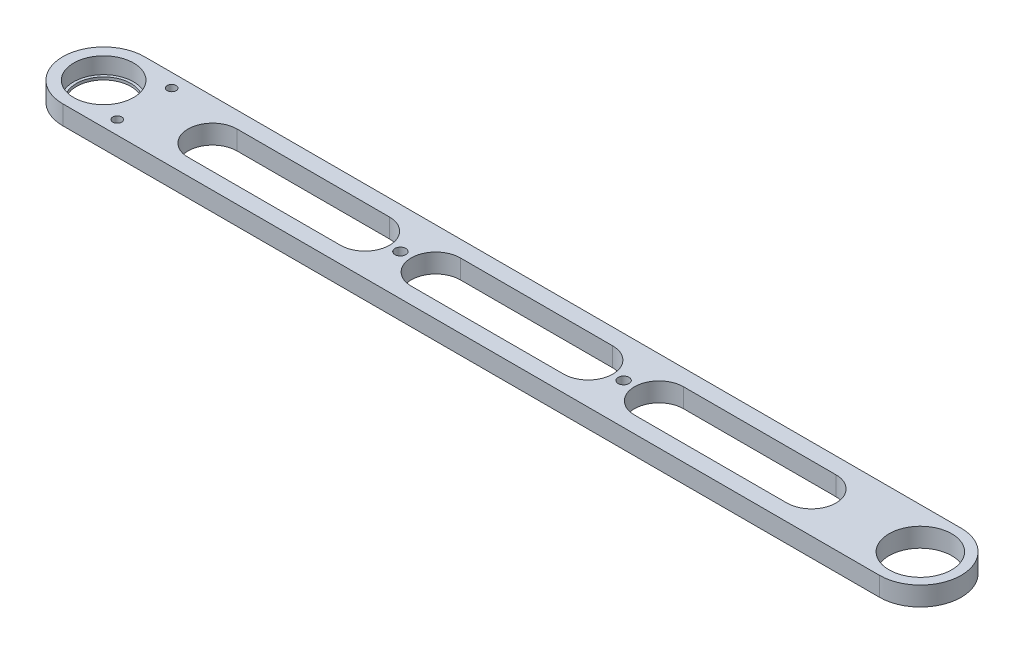
ISO-10303-21;
HEADER;
FILE_DESCRIPTION(('STEP AP214'),'2;1');
FILE_NAME('part.step','',(''),(''),'','','');
FILE_SCHEMA(('AUTOMOTIVE_DESIGN { 1 0 10303 214 1 1 1 1 }'));
ENDSEC;
DATA;
#1=APPLICATION_CONTEXT('core data for automotive mechanical design processes');
#2=APPLICATION_PROTOCOL_DEFINITION('international standard','automotive_design',2000,#1);
#3=PRODUCT_CONTEXT('',#1,'mechanical');
#4=PRODUCT('Part','Part','',(#3));
#5=PRODUCT_RELATED_PRODUCT_CATEGORY('part','',(#4));
#6=PRODUCT_DEFINITION_FORMATION('','',#4);
#7=PRODUCT_DEFINITION_CONTEXT('part definition',#1,'design');
#8=PRODUCT_DEFINITION('design','',#6,#7);
#9=PRODUCT_DEFINITION_SHAPE('','',#8);
#10=(LENGTH_UNIT() NAMED_UNIT(*) SI_UNIT(.MILLI.,.METRE.));
#11=(NAMED_UNIT(*) PLANE_ANGLE_UNIT() SI_UNIT($,.RADIAN.));
#12=(NAMED_UNIT(*) SI_UNIT($,.STERADIAN.) SOLID_ANGLE_UNIT());
#13=UNCERTAINTY_MEASURE_WITH_UNIT(LENGTH_MEASURE(1.E-05),#10,'distance_accuracy_value','');
#14=(GEOMETRIC_REPRESENTATION_CONTEXT(3) GLOBAL_UNCERTAINTY_ASSIGNED_CONTEXT((#13)) GLOBAL_UNIT_ASSIGNED_CONTEXT((#10,
#11,#12)) REPRESENTATION_CONTEXT('',''));
#15=CARTESIAN_POINT('',(0.,0.,0.));
#16=DIRECTION('',(0.,0.,1.));
#17=DIRECTION('',(1.,0.,0.));
#18=AXIS2_PLACEMENT_3D('',#15,#16,#17);
#19=CARTESIAN_POINT('',(-150.,7.,0.));
#20=DIRECTION('',(0.,-1.,0.));
#21=DIRECTION('',(0.,0.,-1.));
#22=AXIS2_PLACEMENT_3D('',#19,#20,#21);
#23=CYLINDRICAL_SURFACE('',#22,10.);
#24=CARTESIAN_POINT('',(-150.,0.,0.));
#25=DIRECTION('',(0.,1.,0.));
#26=DIRECTION('',(0.,0.,1.));
#27=AXIS2_PLACEMENT_3D('',#24,#25,#26);
#28=CIRCLE('',#27,10.);
#29=CARTESIAN_POINT('',(-150.,0.,10.));
#30=VERTEX_POINT('',#29);
#31=EDGE_CURVE('E289',#30,#30,#28,.T.);
#32=ORIENTED_EDGE('',*,*,#31,.F.);
#33=EDGE_LOOP('',(#32));
#34=FACE_BOUND('',#33,.T.);
#35=CARTESIAN_POINT('',(-150.,1.,0.));
#36=DIRECTION('',(0.,1.,0.));
#37=DIRECTION('',(0.,0.,1.));
#38=AXIS2_PLACEMENT_3D('',#35,#36,#37);
#39=CIRCLE('',#38,10.);
#40=CARTESIAN_POINT('',(-150.,1.,10.));
#41=VERTEX_POINT('',#40);
#42=EDGE_CURVE('E47',#41,#41,#39,.T.);
#43=ORIENTED_EDGE('',*,*,#42,.T.);
#44=EDGE_LOOP('',(#43));
#45=FACE_BOUND('',#44,.T.);
#46=ADVANCED_FACE('F43',(#34,#45),#23,.F.);
#47=CARTESIAN_POINT('',(150.,7.,0.));
#48=DIRECTION('',(0.,1.,0.));
#49=DIRECTION('',(0.,0.,1.));
#50=AXIS2_PLACEMENT_3D('',#47,#48,#49);
#51=PLANE('',#50);
#52=CARTESIAN_POINT('',(-135.,7.,-10.));
#53=DIRECTION('',(0.,1.,0.));
#54=DIRECTION('',(0.,0.,1.));
#55=AXIS2_PLACEMENT_3D('',#52,#53,#54);
#56=CIRCLE('',#55,1.64999999999998);
#57=CARTESIAN_POINT('',(-135.,7.,-8.35000000000005));
#58=VERTEX_POINT('',#57);
#59=EDGE_CURVE('E174',#58,#58,#56,.T.);
#60=ORIENTED_EDGE('',*,*,#59,.F.);
#61=EDGE_LOOP('',(#60));
#62=FACE_BOUND('',#61,.T.);
#63=CARTESIAN_POINT('',(-135.,7.,10.));
#64=DIRECTION('',(0.,1.,0.));
#65=DIRECTION('',(0.,0.,1.));
#66=AXIS2_PLACEMENT_3D('',#63,#64,#65);
#67=CIRCLE('',#66,1.64999999999998);
#68=CARTESIAN_POINT('',(-135.,7.,11.65));
#69=VERTEX_POINT('',#68);
#70=EDGE_CURVE('E173',#69,#69,#67,.T.);
#71=ORIENTED_EDGE('',*,*,#70,.F.);
#72=EDGE_LOOP('',(#71));
#73=FACE_BOUND('',#72,.T.);
#74=CARTESIAN_POINT('',(-150.,7.,0.));
#75=DIRECTION('',(0.,1.,0.));
#76=DIRECTION('',(0.,0.,1.));
#77=AXIS2_PLACEMENT_3D('',#74,#75,#76);
#78=CIRCLE('',#77,11.);
#79=CARTESIAN_POINT('',(-150.,7.,11.));
#80=VERTEX_POINT('',#79);
#81=EDGE_CURVE('E184',#80,#80,#78,.T.);
#82=ORIENTED_EDGE('',*,*,#81,.F.);
#83=EDGE_LOOP('',(#82));
#84=FACE_BOUND('',#83,.T.);
#85=CARTESIAN_POINT('',(40.9999999073436,7.,0.));
#86=DIRECTION('',(0.,1.,0.));
#87=DIRECTION('',(0.,0.,1.));
#88=AXIS2_PLACEMENT_3D('',#85,#86,#87);
#89=CIRCLE('',#88,2.);
#90=CARTESIAN_POINT('',(40.9999999073436,7.,2.));
#91=VERTEX_POINT('',#90);
#92=EDGE_CURVE('E197',#91,#91,#89,.T.);
#93=ORIENTED_EDGE('',*,*,#92,.F.);
#94=EDGE_LOOP('',(#93));
#95=FACE_BOUND('',#94,.T.);
#96=CARTESIAN_POINT('',(150.,7.,0.));
#97=DIRECTION('',(0.,1.,0.));
#98=DIRECTION('',(0.,0.,1.));
#99=AXIS2_PLACEMENT_3D('',#96,#97,#98);
#100=CIRCLE('',#99,11.5);
#101=CARTESIAN_POINT('',(150.,7.,11.5));
#102=VERTEX_POINT('',#101);
#103=EDGE_CURVE('E293',#102,#102,#100,.T.);
#104=ORIENTED_EDGE('',*,*,#103,.F.);
#105=EDGE_LOOP('',(#104));
#106=FACE_BOUND('',#105,.T.);
#107=CARTESIAN_POINT('',(150.,7.,0.));
#108=DIRECTION('',(0.,1.,0.));
#109=DIRECTION('',(0.,0.,1.));
#110=AXIS2_PLACEMENT_3D('',#107,#108,#109);
#111=CIRCLE('',#110,15.);
#112=CARTESIAN_POINT('',(150.,7.,15.));
#113=VERTEX_POINT('',#112);
#114=CARTESIAN_POINT('',(150.,7.,-15.0000000000001));
#115=VERTEX_POINT('',#114);
#116=EDGE_CURVE('E299',#113,#115,#111,.T.);
#117=ORIENTED_EDGE('',*,*,#116,.T.);
#118=DIRECTION('',(-1.,0.,0.));
#119=VECTOR('',#118,1.);
#120=CARTESIAN_POINT('',(-150.,7.,-15.));
#121=LINE('',#120,#119);
#122=CARTESIAN_POINT('',(-150.,7.,-15.));
#123=VERTEX_POINT('',#122);
#124=EDGE_CURVE('E302',#115,#123,#121,.T.);
#125=ORIENTED_EDGE('',*,*,#124,.T.);
#126=CARTESIAN_POINT('',(-150.,7.,0.));
#127=DIRECTION('',(0.,1.,0.));
#128=DIRECTION('',(0.,0.,1.));
#129=AXIS2_PLACEMENT_3D('',#126,#127,#128);
#130=CIRCLE('',#129,15.);
#131=CARTESIAN_POINT('',(-150.,7.,15.));
#132=VERTEX_POINT('',#131);
#133=EDGE_CURVE('E305',#123,#132,#130,.T.);
#134=ORIENTED_EDGE('',*,*,#133,.T.);
#135=DIRECTION('',(1.,0.,0.));
#136=VECTOR('',#135,1.);
#137=CARTESIAN_POINT('',(150.,7.,15.));
#138=LINE('',#137,#136);
#139=EDGE_CURVE('E307',#132,#113,#138,.T.);
#140=ORIENTED_EDGE('',*,*,#139,.T.);
#141=EDGE_LOOP('',(#117,#125,#134,#140));
#142=FACE_BOUND('',#141,.T.);
#143=DIRECTION('',(1.,0.,0.));
#144=VECTOR('',#143,1.);
#145=CARTESIAN_POINT('',(-110.,7.,9.));
#146=LINE('',#145,#144);
#147=CARTESIAN_POINT('',(-110.,7.,9.));
#148=VERTEX_POINT('',#147);
#149=CARTESIAN_POINT('',(-53.9999999803265,7.,9.));
#150=VERTEX_POINT('',#149);
#151=EDGE_CURVE('E261',#148,#150,#146,.T.);
#152=ORIENTED_EDGE('',*,*,#151,.F.);
#153=CARTESIAN_POINT('',(-110.,7.,0.));
#154=DIRECTION('',(0.,1.,0.));
#155=DIRECTION('',(0.,0.,-1.));
#156=AXIS2_PLACEMENT_3D('',#153,#154,#155);
#157=CIRCLE('',#156,9.);
#158=CARTESIAN_POINT('',(-110.,7.,-9.));
#159=VERTEX_POINT('',#158);
#160=EDGE_CURVE('E259',#159,#148,#157,.T.);
#161=ORIENTED_EDGE('',*,*,#160,.F.);
#162=DIRECTION('',(-1.,0.,0.));
#163=VECTOR('',#162,1.);
#164=CARTESIAN_POINT('',(-53.9999999803265,7.,-9.));
#165=LINE('',#164,#163);
#166=CARTESIAN_POINT('',(-53.9999999803265,7.,-9.));
#167=VERTEX_POINT('',#166);
#168=EDGE_CURVE('E267',#167,#159,#165,.T.);
#169=ORIENTED_EDGE('',*,*,#168,.F.);
#170=CARTESIAN_POINT('',(-53.9999999803265,7.,0.));
#171=DIRECTION('',(0.,1.,0.));
#172=DIRECTION('',(0.,0.,1.));
#173=AXIS2_PLACEMENT_3D('',#170,#171,#172);
#174=CIRCLE('',#173,9.);
#175=EDGE_CURVE('E264',#150,#167,#174,.T.);
#176=ORIENTED_EDGE('',*,*,#175,.F.);
#177=EDGE_LOOP('',(#152,#161,#169,#176));
#178=FACE_BOUND('',#177,.T.);
#179=DIRECTION('',(1.,0.,0.));
#180=VECTOR('',#179,1.);
#181=CARTESIAN_POINT('',(-28.00000011233,7.,9.));
#182=LINE('',#181,#180);
#183=CARTESIAN_POINT('',(-28.00000011233,7.,9.));
#184=VERTEX_POINT('',#183);
#185=CARTESIAN_POINT('',(27.9999999073436,7.,9.));
#186=VERTEX_POINT('',#185);
#187=EDGE_CURVE('E230',#184,#186,#182,.T.);
#188=ORIENTED_EDGE('',*,*,#187,.F.);
#189=CARTESIAN_POINT('',(-27.9999999803265,7.,0.));
#190=DIRECTION('',(0.,1.,0.));
#191=DIRECTION('',(0.,0.,-1.));
#192=AXIS2_PLACEMENT_3D('',#189,#190,#191);
#193=CIRCLE('',#192,9.);
#194=CARTESIAN_POINT('',(-28.00000011233,7.,-9.));
#195=VERTEX_POINT('',#194);
#196=EDGE_CURVE('E228',#195,#184,#193,.T.);
#197=ORIENTED_EDGE('',*,*,#196,.F.);
#198=DIRECTION('',(-1.,0.,0.));
#199=VECTOR('',#198,1.);
#200=CARTESIAN_POINT('',(27.9999999073436,7.,-9.));
#201=LINE('',#200,#199);
#202=CARTESIAN_POINT('',(27.9999999073436,7.,-9.));
#203=VERTEX_POINT('',#202);
#204=EDGE_CURVE('E236',#203,#195,#201,.T.);
#205=ORIENTED_EDGE('',*,*,#204,.F.);
#206=CARTESIAN_POINT('',(27.9999999073436,7.,0.));
#207=DIRECTION('',(0.,1.,0.));
#208=DIRECTION('',(0.,0.,1.));
#209=AXIS2_PLACEMENT_3D('',#206,#207,#208);
#210=CIRCLE('',#209,9.);
#211=EDGE_CURVE('E233',#186,#203,#210,.T.);
#212=ORIENTED_EDGE('',*,*,#211,.F.);
#213=EDGE_LOOP('',(#188,#197,#205,#212));
#214=FACE_BOUND('',#213,.T.);
#215=DIRECTION('',(1.,0.,0.));
#216=VECTOR('',#215,1.);
#217=CARTESIAN_POINT('',(53.9999999073436,7.,9.));
#218=LINE('',#217,#216);
#219=CARTESIAN_POINT('',(53.9999999073436,7.,9.));
#220=VERTEX_POINT('',#219);
#221=CARTESIAN_POINT('',(109.999999927017,7.,9.));
#222=VERTEX_POINT('',#221);
#223=EDGE_CURVE('E204',#220,#222,#218,.T.);
#224=ORIENTED_EDGE('',*,*,#223,.F.);
#225=CARTESIAN_POINT('',(53.9999999073436,7.,0.));
#226=DIRECTION('',(0.,1.,0.));
#227=DIRECTION('',(0.,0.,-1.));
#228=AXIS2_PLACEMENT_3D('',#225,#226,#227);
#229=CIRCLE('',#228,9.);
#230=CARTESIAN_POINT('',(53.9999999073436,7.,-9.));
#231=VERTEX_POINT('',#230);
#232=EDGE_CURVE('E202',#231,#220,#229,.T.);
#233=ORIENTED_EDGE('',*,*,#232,.F.);
#234=DIRECTION('',(-1.,0.,0.));
#235=VECTOR('',#234,1.);
#236=CARTESIAN_POINT('',(109.999999927017,7.,-9.));
#237=LINE('',#236,#235);
#238=CARTESIAN_POINT('',(109.999999927017,7.,-9.));
#239=VERTEX_POINT('',#238);
#240=EDGE_CURVE('E209',#239,#231,#237,.T.);
#241=ORIENTED_EDGE('',*,*,#240,.F.);
#242=CARTESIAN_POINT('',(110.,7.,0.));
#243=DIRECTION('',(0.,1.,0.));
#244=DIRECTION('',(0.,0.,1.));
#245=AXIS2_PLACEMENT_3D('',#242,#243,#244);
#246=CIRCLE('',#245,9.);
#247=EDGE_CURVE('E207',#222,#239,#246,.T.);
#248=ORIENTED_EDGE('',*,*,#247,.F.);
#249=EDGE_LOOP('',(#224,#233,#241,#248));
#250=FACE_BOUND('',#249,.T.);
#251=CARTESIAN_POINT('',(-40.9999999803265,7.,0.));
#252=DIRECTION('',(0.,1.,0.));
#253=DIRECTION('',(0.,0.,1.));
#254=AXIS2_PLACEMENT_3D('',#251,#252,#253);
#255=CIRCLE('',#254,2.);
#256=CARTESIAN_POINT('',(-40.9999999803265,7.,2.));
#257=VERTEX_POINT('',#256);
#258=EDGE_CURVE('E190',#257,#257,#255,.T.);
#259=ORIENTED_EDGE('',*,*,#258,.F.);
#260=EDGE_LOOP('',(#259));
#261=FACE_BOUND('',#260,.T.);
#262=ADVANCED_FACE('F343',(#62,#73,#84,#95,#106,#142,#178,#214,#250,#261),#51,.T.);
#263=CARTESIAN_POINT('',(150.,0.,0.));
#264=DIRECTION('',(0.,1.,0.));
#265=DIRECTION('',(0.,0.,1.));
#266=AXIS2_PLACEMENT_3D('',#263,#264,#265);
#267=PLANE('',#266);
#268=CARTESIAN_POINT('',(-27.9999999803265,0.,0.));
#269=DIRECTION('',(0.,1.,0.));
#270=DIRECTION('',(0.,0.,-1.));
#271=AXIS2_PLACEMENT_3D('',#268,#269,#270);
#272=CIRCLE('',#271,9.);
#273=CARTESIAN_POINT('',(-28.0000001123299,0.,-9.));
#274=VERTEX_POINT('',#273);
#275=CARTESIAN_POINT('',(-28.00000011233,0.,9.));
#276=VERTEX_POINT('',#275);
#277=EDGE_CURVE('E227',#274,#276,#272,.T.);
#278=ORIENTED_EDGE('',*,*,#277,.T.);
#279=DIRECTION('',(1.,0.,0.));
#280=VECTOR('',#279,1.);
#281=CARTESIAN_POINT('',(-28.00000011233,0.,9.));
#282=LINE('',#281,#280);
#283=CARTESIAN_POINT('',(27.9999999073436,0.,9.));
#284=VERTEX_POINT('',#283);
#285=EDGE_CURVE('E241',#276,#284,#282,.T.);
#286=ORIENTED_EDGE('',*,*,#285,.T.);
#287=CARTESIAN_POINT('',(27.9999999073436,0.,0.));
#288=DIRECTION('',(0.,1.,0.));
#289=DIRECTION('',(0.,0.,1.));
#290=AXIS2_PLACEMENT_3D('',#287,#288,#289);
#291=CIRCLE('',#290,9.);
#292=CARTESIAN_POINT('',(27.9999999073436,0.,-9.));
#293=VERTEX_POINT('',#292);
#294=EDGE_CURVE('E244',#284,#293,#291,.T.);
#295=ORIENTED_EDGE('',*,*,#294,.T.);
#296=DIRECTION('',(-1.,0.,0.));
#297=VECTOR('',#296,1.);
#298=CARTESIAN_POINT('',(27.9999999073436,0.,-9.));
#299=LINE('',#298,#297);
#300=EDGE_CURVE('E231',#293,#274,#299,.T.);
#301=ORIENTED_EDGE('',*,*,#300,.T.);
#302=EDGE_LOOP('',(#278,#286,#295,#301));
#303=FACE_BOUND('',#302,.T.);
#304=ORIENTED_EDGE('',*,*,#31,.T.);
#305=EDGE_LOOP('',(#304));
#306=FACE_BOUND('',#305,.T.);
#307=CARTESIAN_POINT('',(150.,0.,0.));
#308=DIRECTION('',(0.,1.,0.));
#309=DIRECTION('',(0.,0.,1.));
#310=AXIS2_PLACEMENT_3D('',#307,#308,#309);
#311=CIRCLE('',#310,11.5);
#312=CARTESIAN_POINT('',(150.,0.,11.5));
#313=VERTEX_POINT('',#312);
#314=EDGE_CURVE('E292',#313,#313,#311,.T.);
#315=ORIENTED_EDGE('',*,*,#314,.T.);
#316=EDGE_LOOP('',(#315));
#317=FACE_BOUND('',#316,.T.);
#318=CARTESIAN_POINT('',(150.,0.,0.));
#319=DIRECTION('',(0.,1.,0.));
#320=DIRECTION('',(0.,0.,1.));
#321=AXIS2_PLACEMENT_3D('',#318,#319,#320);
#322=CIRCLE('',#321,15.);
#323=CARTESIAN_POINT('',(150.,0.,15.));
#324=VERTEX_POINT('',#323);
#325=CARTESIAN_POINT('',(150.,0.,-15.0000000000001));
#326=VERTEX_POINT('',#325);
#327=EDGE_CURVE('E296',#324,#326,#322,.T.);
#328=ORIENTED_EDGE('',*,*,#327,.F.);
#329=DIRECTION('',(1.,0.,0.));
#330=VECTOR('',#329,1.);
#331=CARTESIAN_POINT('',(150.,0.,15.));
#332=LINE('',#331,#330);
#333=CARTESIAN_POINT('',(-150.,0.,15.));
#334=VERTEX_POINT('',#333);
#335=EDGE_CURVE('E303',#334,#324,#332,.T.);
#336=ORIENTED_EDGE('',*,*,#335,.F.);
#337=CARTESIAN_POINT('',(-150.,0.,0.));
#338=DIRECTION('',(0.,1.,0.));
#339=DIRECTION('',(0.,0.,1.));
#340=AXIS2_PLACEMENT_3D('',#337,#338,#339);
#341=CIRCLE('',#340,15.);
#342=CARTESIAN_POINT('',(-150.,0.,-15.));
#343=VERTEX_POINT('',#342);
#344=EDGE_CURVE('E314',#343,#334,#341,.T.);
#345=ORIENTED_EDGE('',*,*,#344,.F.);
#346=DIRECTION('',(-1.,0.,0.));
#347=VECTOR('',#346,1.);
#348=CARTESIAN_POINT('',(-150.,0.,-15.));
#349=LINE('',#348,#347);
#350=EDGE_CURVE('E312',#326,#343,#349,.T.);
#351=ORIENTED_EDGE('',*,*,#350,.F.);
#352=EDGE_LOOP('',(#328,#336,#345,#351));
#353=FACE_BOUND('',#352,.T.);
#354=CARTESIAN_POINT('',(-110.,0.,0.));
#355=DIRECTION('',(0.,1.,0.));
#356=DIRECTION('',(0.,0.,-1.));
#357=AXIS2_PLACEMENT_3D('',#354,#355,#356);
#358=CIRCLE('',#357,9.);
#359=CARTESIAN_POINT('',(-110.,0.,-9.));
#360=VERTEX_POINT('',#359);
#361=CARTESIAN_POINT('',(-110.,0.,9.));
#362=VERTEX_POINT('',#361);
#363=EDGE_CURVE('E258',#360,#362,#358,.T.);
#364=ORIENTED_EDGE('',*,*,#363,.T.);
#365=DIRECTION('',(1.,0.,0.));
#366=VECTOR('',#365,1.);
#367=CARTESIAN_POINT('',(-110.,0.,9.));
#368=LINE('',#367,#366);
#369=CARTESIAN_POINT('',(-53.9999999803265,0.,9.));
#370=VERTEX_POINT('',#369);
#371=EDGE_CURVE('E272',#362,#370,#368,.T.);
#372=ORIENTED_EDGE('',*,*,#371,.T.);
#373=CARTESIAN_POINT('',(-53.9999999803265,0.,0.));
#374=DIRECTION('',(0.,1.,0.));
#375=DIRECTION('',(0.,0.,1.));
#376=AXIS2_PLACEMENT_3D('',#373,#374,#375);
#377=CIRCLE('',#376,9.);
#378=CARTESIAN_POINT('',(-53.9999999803265,0.,-9.));
#379=VERTEX_POINT('',#378);
#380=EDGE_CURVE('E275',#370,#379,#377,.T.);
#381=ORIENTED_EDGE('',*,*,#380,.T.);
#382=DIRECTION('',(-1.,0.,0.));
#383=VECTOR('',#382,1.);
#384=CARTESIAN_POINT('',(-53.9999999803265,0.,-9.));
#385=LINE('',#384,#383);
#386=EDGE_CURVE('E262',#379,#360,#385,.T.);
#387=ORIENTED_EDGE('',*,*,#386,.T.);
#388=EDGE_LOOP('',(#364,#372,#381,#387));
#389=FACE_BOUND('',#388,.T.);
#390=CARTESIAN_POINT('',(53.9999999073436,0.,0.));
#391=DIRECTION('',(0.,1.,0.));
#392=DIRECTION('',(0.,0.,-1.));
#393=AXIS2_PLACEMENT_3D('',#390,#391,#392);
#394=CIRCLE('',#393,9.);
#395=CARTESIAN_POINT('',(53.9999999073436,0.,-9.));
#396=VERTEX_POINT('',#395);
#397=CARTESIAN_POINT('',(53.9999999073436,0.,9.));
#398=VERTEX_POINT('',#397);
#399=EDGE_CURVE('E67',#396,#398,#394,.T.);
#400=ORIENTED_EDGE('',*,*,#399,.T.);
#401=DIRECTION('',(1.,0.,0.));
#402=VECTOR('',#401,1.);
#403=CARTESIAN_POINT('',(53.9999999073436,0.,9.));
#404=LINE('',#403,#402);
#405=CARTESIAN_POINT('',(109.999999927017,0.,9.));
#406=VERTEX_POINT('',#405);
#407=EDGE_CURVE('E213',#398,#406,#404,.T.);
#408=ORIENTED_EDGE('',*,*,#407,.T.);
#409=CARTESIAN_POINT('',(110.,0.,0.));
#410=DIRECTION('',(0.,1.,0.));
#411=DIRECTION('',(0.,0.,1.));
#412=AXIS2_PLACEMENT_3D('',#409,#410,#411);
#413=CIRCLE('',#412,9.);
#414=CARTESIAN_POINT('',(109.999999927017,0.,-9.));
#415=VERTEX_POINT('',#414);
#416=EDGE_CURVE('E216',#406,#415,#413,.T.);
#417=ORIENTED_EDGE('',*,*,#416,.T.);
#418=DIRECTION('',(-1.,0.,0.));
#419=VECTOR('',#418,1.);
#420=CARTESIAN_POINT('',(109.999999927017,0.,-9.));
#421=LINE('',#420,#419);
#422=EDGE_CURVE('E205',#415,#396,#421,.T.);
#423=ORIENTED_EDGE('',*,*,#422,.T.);
#424=EDGE_LOOP('',(#400,#408,#417,#423));
#425=FACE_BOUND('',#424,.T.);
#426=CARTESIAN_POINT('',(40.9999999073436,0.,0.));
#427=DIRECTION('',(0.,1.,0.));
#428=DIRECTION('',(0.,0.,1.));
#429=AXIS2_PLACEMENT_3D('',#426,#427,#428);
#430=CIRCLE('',#429,2.);
#431=CARTESIAN_POINT('',(40.9999999073436,0.,2.));
#432=VERTEX_POINT('',#431);
#433=EDGE_CURVE('E193',#432,#432,#430,.T.);
#434=ORIENTED_EDGE('',*,*,#433,.T.);
#435=EDGE_LOOP('',(#434));
#436=FACE_BOUND('',#435,.T.);
#437=CARTESIAN_POINT('',(-40.9999999803265,0.,0.));
#438=DIRECTION('',(0.,1.,0.));
#439=DIRECTION('',(0.,0.,1.));
#440=AXIS2_PLACEMENT_3D('',#437,#438,#439);
#441=CIRCLE('',#440,2.);
#442=CARTESIAN_POINT('',(-40.9999999803265,0.,2.));
#443=VERTEX_POINT('',#442);
#444=EDGE_CURVE('E194',#443,#443,#441,.T.);
#445=ORIENTED_EDGE('',*,*,#444,.T.);
#446=EDGE_LOOP('',(#445));
#447=FACE_BOUND('',#446,.T.);
#448=ADVANCED_FACE('F333',(#303,#306,#317,#353,#389,#425,#436,#447),#267,.F.);
#449=CARTESIAN_POINT('',(150.,7.,0.));
#450=DIRECTION('',(0.,-1.,0.));
#451=DIRECTION('',(0.,0.,-1.));
#452=AXIS2_PLACEMENT_3D('',#449,#450,#451);
#453=CYLINDRICAL_SURFACE('',#452,15.);
#454=ORIENTED_EDGE('',*,*,#327,.T.);
#455=DIRECTION('',(0.,-1.,0.));
#456=VECTOR('',#455,1.);
#457=CARTESIAN_POINT('',(150.,7.,-15.0000000000001));
#458=LINE('',#457,#456);
#459=EDGE_CURVE('E11',#115,#326,#458,.T.);
#460=ORIENTED_EDGE('',*,*,#459,.F.);
#461=ORIENTED_EDGE('',*,*,#116,.F.);
#462=DIRECTION('',(0.,-1.,0.));
#463=VECTOR('',#462,1.);
#464=CARTESIAN_POINT('',(150.,7.,15.));
#465=LINE('',#464,#463);
#466=EDGE_CURVE('E309',#113,#324,#465,.T.);
#467=ORIENTED_EDGE('',*,*,#466,.T.);
#468=EDGE_LOOP('',(#454,#460,#461,#467));
#469=FACE_BOUND('',#468,.T.);
#470=ADVANCED_FACE('F45',(#469),#453,.T.);
#471=CARTESIAN_POINT('',(-150.,7.,-15.));
#472=DIRECTION('',(0.,0.,1.));
#473=DIRECTION('',(1.,0.,0.));
#474=AXIS2_PLACEMENT_3D('',#471,#472,#473);
#475=PLANE('',#474);
#476=ORIENTED_EDGE('',*,*,#350,.T.);
#477=DIRECTION('',(0.,-1.,0.));
#478=VECTOR('',#477,1.);
#479=CARTESIAN_POINT('',(-150.,7.,-15.));
#480=LINE('',#479,#478);
#481=EDGE_CURVE('E52',#123,#343,#480,.T.);
#482=ORIENTED_EDGE('',*,*,#481,.F.);
#483=ORIENTED_EDGE('',*,*,#124,.F.);
#484=ORIENTED_EDGE('',*,*,#459,.T.);
#485=EDGE_LOOP('',(#476,#482,#483,#484));
#486=FACE_BOUND('',#485,.T.);
#487=ADVANCED_FACE('F345',(#486),#475,.F.);
#488=CARTESIAN_POINT('',(-150.,7.,0.));
#489=DIRECTION('',(0.,-1.,0.));
#490=DIRECTION('',(0.,0.,-1.));
#491=AXIS2_PLACEMENT_3D('',#488,#489,#490);
#492=CYLINDRICAL_SURFACE('',#491,15.);
#493=ORIENTED_EDGE('',*,*,#344,.T.);
#494=DIRECTION('',(0.,-1.,0.));
#495=VECTOR('',#494,1.);
#496=CARTESIAN_POINT('',(-150.,7.,15.));
#497=LINE('',#496,#495);
#498=EDGE_CURVE('E319',#132,#334,#497,.T.);
#499=ORIENTED_EDGE('',*,*,#498,.F.);
#500=ORIENTED_EDGE('',*,*,#133,.F.);
#501=ORIENTED_EDGE('',*,*,#481,.T.);
#502=EDGE_LOOP('',(#493,#499,#500,#501));
#503=FACE_BOUND('',#502,.T.);
#504=ADVANCED_FACE('F327',(#503),#492,.T.);
#505=CARTESIAN_POINT('',(150.,7.,15.));
#506=DIRECTION('',(0.,0.,-1.));
#507=DIRECTION('',(-1.,0.,0.));
#508=AXIS2_PLACEMENT_3D('',#505,#506,#507);
#509=PLANE('',#508);
#510=ORIENTED_EDGE('',*,*,#335,.T.);
#511=ORIENTED_EDGE('',*,*,#466,.F.);
#512=ORIENTED_EDGE('',*,*,#139,.F.);
#513=ORIENTED_EDGE('',*,*,#498,.T.);
#514=EDGE_LOOP('',(#510,#511,#512,#513));
#515=FACE_BOUND('',#514,.T.);
#516=ADVANCED_FACE('F337',(#515),#509,.F.);
#517=CARTESIAN_POINT('',(150.,7.,0.));
#518=DIRECTION('',(0.,-1.,0.));
#519=DIRECTION('',(0.,0.,-1.));
#520=AXIS2_PLACEMENT_3D('',#517,#518,#519);
#521=CYLINDRICAL_SURFACE('',#520,11.5);
#522=ORIENTED_EDGE('',*,*,#103,.T.);
#523=EDGE_LOOP('',(#522));
#524=FACE_BOUND('',#523,.T.);
#525=ORIENTED_EDGE('',*,*,#314,.F.);
#526=EDGE_LOOP('',(#525));
#527=FACE_BOUND('',#526,.T.);
#528=ADVANCED_FACE('F368',(#524,#527),#521,.F.);
#529=CARTESIAN_POINT('',(-110.,7.,0.));
#530=DIRECTION('',(0.,-1.,0.));
#531=DIRECTION('',(0.,0.,-1.));
#532=AXIS2_PLACEMENT_3D('',#529,#530,#531);
#533=CYLINDRICAL_SURFACE('',#532,9.);
#534=ORIENTED_EDGE('',*,*,#363,.F.);
#535=DIRECTION('',(0.,-1.,0.));
#536=VECTOR('',#535,1.);
#537=CARTESIAN_POINT('',(-110.,7.,-9.));
#538=LINE('',#537,#536);
#539=EDGE_CURVE('E269',#159,#360,#538,.T.);
#540=ORIENTED_EDGE('',*,*,#539,.F.);
#541=ORIENTED_EDGE('',*,*,#160,.T.);
#542=DIRECTION('',(0.,-1.,0.));
#543=VECTOR('',#542,1.);
#544=CARTESIAN_POINT('',(-110.,7.,9.));
#545=LINE('',#544,#543);
#546=EDGE_CURVE('E286',#148,#362,#545,.T.);
#547=ORIENTED_EDGE('',*,*,#546,.T.);
#548=EDGE_LOOP('',(#534,#540,#541,#547));
#549=FACE_BOUND('',#548,.T.);
#550=ADVANCED_FACE('F366',(#549),#533,.F.);
#551=CARTESIAN_POINT('',(-110.,7.,9.));
#552=DIRECTION('',(0.,0.,-1.));
#553=DIRECTION('',(-1.,0.,0.));
#554=AXIS2_PLACEMENT_3D('',#551,#552,#553);
#555=PLANE('',#554);
#556=ORIENTED_EDGE('',*,*,#371,.F.);
#557=ORIENTED_EDGE('',*,*,#546,.F.);
#558=ORIENTED_EDGE('',*,*,#151,.T.);
#559=DIRECTION('',(0.,-1.,0.));
#560=VECTOR('',#559,1.);
#561=CARTESIAN_POINT('',(-53.9999999803265,7.,9.));
#562=LINE('',#561,#560);
#563=EDGE_CURVE('E284',#150,#370,#562,.T.);
#564=ORIENTED_EDGE('',*,*,#563,.T.);
#565=EDGE_LOOP('',(#556,#557,#558,#564));
#566=FACE_BOUND('',#565,.T.);
#567=ADVANCED_FACE('F390',(#566),#555,.T.);
#568=CARTESIAN_POINT('',(-53.9999999803265,7.,0.));
#569=DIRECTION('',(0.,-1.,0.));
#570=DIRECTION('',(0.,0.,-1.));
#571=AXIS2_PLACEMENT_3D('',#568,#569,#570);
#572=CYLINDRICAL_SURFACE('',#571,9.);
#573=ORIENTED_EDGE('',*,*,#380,.F.);
#574=ORIENTED_EDGE('',*,*,#563,.F.);
#575=ORIENTED_EDGE('',*,*,#175,.T.);
#576=DIRECTION('',(0.,-1.,0.));
#577=VECTOR('',#576,1.);
#578=CARTESIAN_POINT('',(-53.9999999803265,7.,-9.));
#579=LINE('',#578,#577);
#580=EDGE_CURVE('E282',#167,#379,#579,.T.);
#581=ORIENTED_EDGE('',*,*,#580,.T.);
#582=EDGE_LOOP('',(#573,#574,#575,#581));
#583=FACE_BOUND('',#582,.T.);
#584=ADVANCED_FACE('F397',(#583),#572,.F.);
#585=CARTESIAN_POINT('',(-53.9999999803265,7.,-9.));
#586=DIRECTION('',(0.,0.,1.));
#587=DIRECTION('',(1.,0.,0.));
#588=AXIS2_PLACEMENT_3D('',#585,#586,#587);
#589=PLANE('',#588);
#590=ORIENTED_EDGE('',*,*,#386,.F.);
#591=ORIENTED_EDGE('',*,*,#580,.F.);
#592=ORIENTED_EDGE('',*,*,#168,.T.);
#593=ORIENTED_EDGE('',*,*,#539,.T.);
#594=EDGE_LOOP('',(#590,#591,#592,#593));
#595=FACE_BOUND('',#594,.T.);
#596=ADVANCED_FACE('F404',(#595),#589,.T.);
#597=CARTESIAN_POINT('',(-27.9999999803265,7.,0.));
#598=DIRECTION('',(0.,-1.,0.));
#599=DIRECTION('',(0.,0.,-1.));
#600=AXIS2_PLACEMENT_3D('',#597,#598,#599);
#601=CYLINDRICAL_SURFACE('',#600,9.);
#602=ORIENTED_EDGE('',*,*,#277,.F.);
#603=DIRECTION('',(0.,-1.,0.));
#604=VECTOR('',#603,1.);
#605=CARTESIAN_POINT('',(-28.00000011233,7.,-9.));
#606=LINE('',#605,#604);
#607=EDGE_CURVE('E238',#195,#274,#606,.T.);
#608=ORIENTED_EDGE('',*,*,#607,.F.);
#609=ORIENTED_EDGE('',*,*,#196,.T.);
#610=DIRECTION('',(0.,-1.,0.));
#611=VECTOR('',#610,1.);
#612=CARTESIAN_POINT('',(-28.00000011233,7.,9.));
#613=LINE('',#612,#611);
#614=EDGE_CURVE('E255',#184,#276,#613,.T.);
#615=ORIENTED_EDGE('',*,*,#614,.T.);
#616=EDGE_LOOP('',(#602,#608,#609,#615));
#617=FACE_BOUND('',#616,.T.);
#618=ADVANCED_FACE('F412',(#617),#601,.F.);
#619=CARTESIAN_POINT('',(-28.00000011233,7.,9.));
#620=DIRECTION('',(0.,0.,-1.));
#621=DIRECTION('',(-1.,0.,0.));
#622=AXIS2_PLACEMENT_3D('',#619,#620,#621);
#623=PLANE('',#622);
#624=ORIENTED_EDGE('',*,*,#285,.F.);
#625=ORIENTED_EDGE('',*,*,#614,.F.);
#626=ORIENTED_EDGE('',*,*,#187,.T.);
#627=DIRECTION('',(0.,-1.,0.));
#628=VECTOR('',#627,1.);
#629=CARTESIAN_POINT('',(27.9999999073436,7.,9.));
#630=LINE('',#629,#628);
#631=EDGE_CURVE('E253',#186,#284,#630,.T.);
#632=ORIENTED_EDGE('',*,*,#631,.T.);
#633=EDGE_LOOP('',(#624,#625,#626,#632));
#634=FACE_BOUND('',#633,.T.);
#635=ADVANCED_FACE('F420',(#634),#623,.T.);
#636=CARTESIAN_POINT('',(27.9999999073436,7.,0.));
#637=DIRECTION('',(0.,-1.,0.));
#638=DIRECTION('',(0.,0.,-1.));
#639=AXIS2_PLACEMENT_3D('',#636,#637,#638);
#640=CYLINDRICAL_SURFACE('',#639,9.);
#641=ORIENTED_EDGE('',*,*,#294,.F.);
#642=ORIENTED_EDGE('',*,*,#631,.F.);
#643=ORIENTED_EDGE('',*,*,#211,.T.);
#644=DIRECTION('',(0.,-1.,0.));
#645=VECTOR('',#644,1.);
#646=CARTESIAN_POINT('',(27.9999999073436,7.,-9.));
#647=LINE('',#646,#645);
#648=EDGE_CURVE('E251',#203,#293,#647,.T.);
#649=ORIENTED_EDGE('',*,*,#648,.T.);
#650=EDGE_LOOP('',(#641,#642,#643,#649));
#651=FACE_BOUND('',#650,.T.);
#652=ADVANCED_FACE('F428',(#651),#640,.F.);
#653=CARTESIAN_POINT('',(27.9999999073436,7.,-9.));
#654=DIRECTION('',(0.,0.,1.));
#655=DIRECTION('',(1.,0.,0.));
#656=AXIS2_PLACEMENT_3D('',#653,#654,#655);
#657=PLANE('',#656);
#658=ORIENTED_EDGE('',*,*,#300,.F.);
#659=ORIENTED_EDGE('',*,*,#648,.F.);
#660=ORIENTED_EDGE('',*,*,#204,.T.);
#661=ORIENTED_EDGE('',*,*,#607,.T.);
#662=EDGE_LOOP('',(#658,#659,#660,#661));
#663=FACE_BOUND('',#662,.T.);
#664=ADVANCED_FACE('F436',(#663),#657,.T.);
#665=CARTESIAN_POINT('',(53.9999999073436,7.,0.));
#666=DIRECTION('',(0.,-1.,0.));
#667=DIRECTION('',(0.,0.,-1.));
#668=AXIS2_PLACEMENT_3D('',#665,#666,#667);
#669=CYLINDRICAL_SURFACE('',#668,9.);
#670=ORIENTED_EDGE('',*,*,#399,.F.);
#671=DIRECTION('',(0.,-1.,0.));
#672=VECTOR('',#671,1.);
#673=CARTESIAN_POINT('',(53.9999999073436,7.,-9.));
#674=LINE('',#673,#672);
#675=EDGE_CURVE('E211',#231,#396,#674,.T.);
#676=ORIENTED_EDGE('',*,*,#675,.F.);
#677=ORIENTED_EDGE('',*,*,#232,.T.);
#678=DIRECTION('',(0.,-1.,0.));
#679=VECTOR('',#678,1.);
#680=CARTESIAN_POINT('',(53.9999999073436,7.,9.));
#681=LINE('',#680,#679);
#682=EDGE_CURVE('E225',#220,#398,#681,.T.);
#683=ORIENTED_EDGE('',*,*,#682,.T.);
#684=EDGE_LOOP('',(#670,#676,#677,#683));
#685=FACE_BOUND('',#684,.T.);
#686=ADVANCED_FACE('F444',(#685),#669,.F.);
#687=CARTESIAN_POINT('',(53.9999999073436,7.,9.));
#688=DIRECTION('',(0.,0.,-1.));
#689=DIRECTION('',(-1.,0.,0.));
#690=AXIS2_PLACEMENT_3D('',#687,#688,#689);
#691=PLANE('',#690);
#692=ORIENTED_EDGE('',*,*,#407,.F.);
#693=ORIENTED_EDGE('',*,*,#682,.F.);
#694=ORIENTED_EDGE('',*,*,#223,.T.);
#695=DIRECTION('',(0.,-1.,0.));
#696=VECTOR('',#695,1.);
#697=CARTESIAN_POINT('',(109.999999927017,7.,9.));
#698=LINE('',#697,#696);
#699=EDGE_CURVE('E223',#222,#406,#698,.T.);
#700=ORIENTED_EDGE('',*,*,#699,.T.);
#701=EDGE_LOOP('',(#692,#693,#694,#700));
#702=FACE_BOUND('',#701,.T.);
#703=ADVANCED_FACE('F452',(#702),#691,.T.);
#704=CARTESIAN_POINT('',(110.,7.,0.));
#705=DIRECTION('',(0.,-1.,0.));
#706=DIRECTION('',(0.,0.,-1.));
#707=AXIS2_PLACEMENT_3D('',#704,#705,#706);
#708=CYLINDRICAL_SURFACE('',#707,9.);
#709=ORIENTED_EDGE('',*,*,#416,.F.);
#710=ORIENTED_EDGE('',*,*,#699,.F.);
#711=ORIENTED_EDGE('',*,*,#247,.T.);
#712=DIRECTION('',(0.,-1.,0.));
#713=VECTOR('',#712,1.);
#714=CARTESIAN_POINT('',(109.999999927017,7.,-9.));
#715=LINE('',#714,#713);
#716=EDGE_CURVE('E59',#239,#415,#715,.T.);
#717=ORIENTED_EDGE('',*,*,#716,.T.);
#718=EDGE_LOOP('',(#709,#710,#711,#717));
#719=FACE_BOUND('',#718,.T.);
#720=ADVANCED_FACE('F459',(#719),#708,.F.);
#721=CARTESIAN_POINT('',(109.999999927017,7.,-9.));
#722=DIRECTION('',(0.,0.,1.));
#723=DIRECTION('',(1.,0.,0.));
#724=AXIS2_PLACEMENT_3D('',#721,#722,#723);
#725=PLANE('',#724);
#726=ORIENTED_EDGE('',*,*,#422,.F.);
#727=ORIENTED_EDGE('',*,*,#716,.F.);
#728=ORIENTED_EDGE('',*,*,#240,.T.);
#729=ORIENTED_EDGE('',*,*,#675,.T.);
#730=EDGE_LOOP('',(#726,#727,#728,#729));
#731=FACE_BOUND('',#730,.T.);
#732=ADVANCED_FACE('F467',(#731),#725,.T.);
#733=CARTESIAN_POINT('',(40.9999999073436,7.,0.));
#734=DIRECTION('',(0.,-1.,0.));
#735=DIRECTION('',(0.,0.,-1.));
#736=AXIS2_PLACEMENT_3D('',#733,#734,#735);
#737=CYLINDRICAL_SURFACE('',#736,2.);
#738=ORIENTED_EDGE('',*,*,#92,.T.);
#739=EDGE_LOOP('',(#738));
#740=FACE_BOUND('',#739,.T.);
#741=ORIENTED_EDGE('',*,*,#433,.F.);
#742=EDGE_LOOP('',(#741));
#743=FACE_BOUND('',#742,.T.);
#744=ADVANCED_FACE('F475',(#740,#743),#737,.F.);
#745=CARTESIAN_POINT('',(-40.9999999803265,7.,0.));
#746=DIRECTION('',(0.,-1.,0.));
#747=DIRECTION('',(0.,0.,-1.));
#748=AXIS2_PLACEMENT_3D('',#745,#746,#747);
#749=CYLINDRICAL_SURFACE('',#748,2.);
#750=ORIENTED_EDGE('',*,*,#258,.T.);
#751=EDGE_LOOP('',(#750));
#752=FACE_BOUND('',#751,.T.);
#753=ORIENTED_EDGE('',*,*,#444,.F.);
#754=EDGE_LOOP('',(#753));
#755=FACE_BOUND('',#754,.T.);
#756=ADVANCED_FACE('F481',(#752,#755),#749,.F.);
#757=CARTESIAN_POINT('',(-150.,1.,0.));
#758=DIRECTION('',(0.,1.,0.));
#759=DIRECTION('',(0.,0.,1.));
#760=AXIS2_PLACEMENT_3D('',#757,#758,#759);
#761=CYLINDRICAL_SURFACE('',#760,11.);
#762=CARTESIAN_POINT('',(-150.,1.,0.));
#763=DIRECTION('',(0.,1.,0.));
#764=DIRECTION('',(0.,0.,1.));
#765=AXIS2_PLACEMENT_3D('',#762,#763,#764);
#766=CIRCLE('',#765,11.);
#767=CARTESIAN_POINT('',(-150.,1.,11.));
#768=VERTEX_POINT('',#767);
#769=EDGE_CURVE('E185',#768,#768,#766,.T.);
#770=ORIENTED_EDGE('',*,*,#769,.F.);
#771=EDGE_LOOP('',(#770));
#772=FACE_BOUND('',#771,.T.);
#773=ORIENTED_EDGE('',*,*,#81,.T.);
#774=EDGE_LOOP('',(#773));
#775=FACE_BOUND('',#774,.T.);
#776=ADVANCED_FACE('F488',(#772,#775),#761,.F.);
#777=CARTESIAN_POINT('',(-150.,1.,0.));
#778=DIRECTION('',(0.,1.,0.));
#779=DIRECTION('',(0.,0.,1.));
#780=AXIS2_PLACEMENT_3D('',#777,#778,#779);
#781=PLANE('',#780);
#782=ORIENTED_EDGE('',*,*,#42,.F.);
#783=EDGE_LOOP('',(#782));
#784=FACE_BOUND('',#783,.T.);
#785=ORIENTED_EDGE('',*,*,#769,.T.);
#786=EDGE_LOOP('',(#785));
#787=FACE_BOUND('',#786,.T.);
#788=ADVANCED_FACE('F499',(#784,#787),#781,.T.);
#789=CARTESIAN_POINT('',(-135.,2.,10.));
#790=DIRECTION('',(0.,1.,0.));
#791=DIRECTION('',(0.,0.,1.));
#792=AXIS2_PLACEMENT_3D('',#789,#790,#791);
#793=CONICAL_SURFACE('',#792,1.64999999999998,1.02974425867665);
#794=CARTESIAN_POINT('',(-135.,1.00857997860453,10.));
#795=VERTEX_POINT('',#794);
#796=VERTEX_LOOP('',#795);
#797=FACE_BOUND('',#796,.T.);
#798=CARTESIAN_POINT('',(-135.,2.,10.));
#799=DIRECTION('',(0.,1.,0.));
#800=DIRECTION('',(0.,0.,1.));
#801=AXIS2_PLACEMENT_3D('',#798,#799,#800);
#802=CIRCLE('',#801,1.64999999999998);
#803=CARTESIAN_POINT('',(-135.,2.,11.65));
#804=VERTEX_POINT('',#803);
#805=EDGE_CURVE('E177',#804,#804,#802,.T.);
#806=ORIENTED_EDGE('',*,*,#805,.T.);
#807=EDGE_LOOP('',(#806));
#808=FACE_BOUND('',#807,.T.);
#809=ADVANCED_FACE('F507',(#797,#808),#793,.F.);
#810=CARTESIAN_POINT('',(-135.,7.,10.));
#811=DIRECTION('',(0.,1.,0.));
#812=DIRECTION('',(0.,0.,1.));
#813=AXIS2_PLACEMENT_3D('',#810,#811,#812);
#814=CYLINDRICAL_SURFACE('',#813,1.64999999999998);
#815=ORIENTED_EDGE('',*,*,#805,.F.);
#816=EDGE_LOOP('',(#815));
#817=FACE_BOUND('',#816,.T.);
#818=ORIENTED_EDGE('',*,*,#70,.T.);
#819=EDGE_LOOP('',(#818));
#820=FACE_BOUND('',#819,.T.);
#821=ADVANCED_FACE('F167',(#817,#820),#814,.F.);
#822=CARTESIAN_POINT('',(-135.,2.,-10.));
#823=DIRECTION('',(0.,1.,0.));
#824=DIRECTION('',(0.,0.,1.));
#825=AXIS2_PLACEMENT_3D('',#822,#823,#824);
#826=CONICAL_SURFACE('',#825,1.64999999999998,1.02974425867665);
#827=CARTESIAN_POINT('',(-135.,1.00857997860453,-10.));
#828=VERTEX_POINT('',#827);
#829=VERTEX_LOOP('',#828);
#830=FACE_BOUND('',#829,.T.);
#831=CARTESIAN_POINT('',(-135.,2.,-10.));
#832=DIRECTION('',(0.,1.,0.));
#833=DIRECTION('',(0.,0.,1.));
#834=AXIS2_PLACEMENT_3D('',#831,#832,#833);
#835=CIRCLE('',#834,1.64999999999998);
#836=CARTESIAN_POINT('',(-135.,2.,-8.35000000000005));
#837=VERTEX_POINT('',#836);
#838=EDGE_CURVE('E171',#837,#837,#835,.T.);
#839=ORIENTED_EDGE('',*,*,#838,.T.);
#840=EDGE_LOOP('',(#839));
#841=FACE_BOUND('',#840,.T.);
#842=ADVANCED_FACE('F163',(#830,#841),#826,.F.);
#843=CARTESIAN_POINT('',(-135.,7.,-10.));
#844=DIRECTION('',(0.,1.,0.));
#845=DIRECTION('',(0.,0.,1.));
#846=AXIS2_PLACEMENT_3D('',#843,#844,#845);
#847=CYLINDRICAL_SURFACE('',#846,1.64999999999998);
#848=ORIENTED_EDGE('',*,*,#838,.F.);
#849=EDGE_LOOP('',(#848));
#850=FACE_BOUND('',#849,.T.);
#851=ORIENTED_EDGE('',*,*,#59,.T.);
#852=EDGE_LOOP('',(#851));
#853=FACE_BOUND('',#852,.T.);
#854=ADVANCED_FACE('F166',(#850,#853),#847,.F.);
#855=CLOSED_SHELL('',(#46,#262,#448,#470,#487,#504,#516,#528,#550,#567,#584,#596,#618,#635,#652,
#664,#686,#703,#720,#732,#744,#756,#776,#788,#809,#821,#842,#854));
#856=MANIFOLD_SOLID_BREP('B2',#855);
#857=ADVANCED_BREP_SHAPE_REPRESENTATION('',(#18,#856),#14);
#858=SHAPE_DEFINITION_REPRESENTATION(#9,#857);
ENDSEC;
END-ISO-10303-21;
